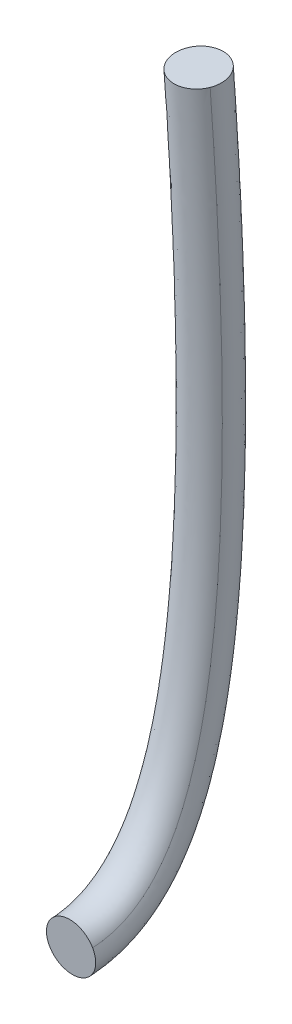
ISO-10303-21;
HEADER;
FILE_DESCRIPTION(('STEP AP214'),'2;1');
FILE_NAME('part.step','',(''),(''),'','','');
FILE_SCHEMA(('AUTOMOTIVE_DESIGN { 1 0 10303 214 1 1 1 1 }'));
ENDSEC;
DATA;
#1=APPLICATION_CONTEXT('core data for automotive mechanical design processes');
#2=APPLICATION_PROTOCOL_DEFINITION('international standard','automotive_design',2000,#1);
#3=PRODUCT_CONTEXT('',#1,'mechanical');
#4=PRODUCT('Part','Part','',(#3));
#5=PRODUCT_RELATED_PRODUCT_CATEGORY('part','',(#4));
#6=PRODUCT_DEFINITION_FORMATION('','',#4);
#7=PRODUCT_DEFINITION_CONTEXT('part definition',#1,'design');
#8=PRODUCT_DEFINITION('design','',#6,#7);
#9=PRODUCT_DEFINITION_SHAPE('','',#8);
#10=(LENGTH_UNIT() NAMED_UNIT(*) SI_UNIT(.MILLI.,.METRE.));
#11=(NAMED_UNIT(*) PLANE_ANGLE_UNIT() SI_UNIT($,.RADIAN.));
#12=(NAMED_UNIT(*) SI_UNIT($,.STERADIAN.) SOLID_ANGLE_UNIT());
#13=UNCERTAINTY_MEASURE_WITH_UNIT(LENGTH_MEASURE(1.E-05),#10,'distance_accuracy_value','');
#14=(GEOMETRIC_REPRESENTATION_CONTEXT(3) GLOBAL_UNCERTAINTY_ASSIGNED_CONTEXT((#13)) GLOBAL_UNIT_ASSIGNED_CONTEXT((#10,
#11,#12)) REPRESENTATION_CONTEXT('',''));
#15=CARTESIAN_POINT('',(0.,0.,0.));
#16=DIRECTION('',(0.,0.,1.));
#17=DIRECTION('',(1.,0.,0.));
#18=AXIS2_PLACEMENT_3D('',#15,#16,#17);
#19=CARTESIAN_POINT('',(-7.41712336251966,-7.28809487388892,11.1726740146158));
#20=CARTESIAN_POINT('',(-7.41712336251957,-7.28391219096522,11.0968550340527));
#21=CARTESIAN_POINT('',(-7.41712336251942,-7.25716208441642,10.9541599167949));
#22=CARTESIAN_POINT('',(-7.41712336251929,-7.13145043749268,10.6996011042162));
#23=CARTESIAN_POINT('',(-7.4171233625194,-6.82483017855781,10.4240618021488));
#24=CARTESIAN_POINT('',(-7.41712336251977,-6.16587858931999,10.1770965163929));
#25=CARTESIAN_POINT('',(-7.41712336252028,-5.06030301226849,10.0061301753601));
#26=CARTESIAN_POINT('',(-7.41712336252057,-3.38306327462149,9.96226459069808));
#27=CARTESIAN_POINT('',(-7.41712336252011,-1.84087282569988,10.0365899468089));
#28=CARTESIAN_POINT('',(-7.41712336251966,-1.00711974868314,10.0974834515681));
#29=CARTESIAN_POINT('',(-7.44624728504393,-7.22774584797431,11.1760032711987));
#30=CARTESIAN_POINT('',(-7.44624728504384,-7.22383978394823,11.1051985274795));
#31=CARTESIAN_POINT('',(-7.44624728504369,-7.19892670294291,10.9732426005261));
#32=CARTESIAN_POINT('',(-7.44624728504355,-7.08368946089006,10.7396358003898));
#33=CARTESIAN_POINT('',(-7.44624728504366,-6.79661128966213,10.479007592827));
#34=CARTESIAN_POINT('',(-7.44624728504404,-6.15268876220548,10.2363630655373));
#35=CARTESIAN_POINT('',(-7.44624728504454,-5.05655341289494,10.0666594916023));
#36=CARTESIAN_POINT('',(-7.44624728504483,-3.38436013673548,10.0227000403105));
#37=CARTESIAN_POINT('',(-7.44624728504437,-1.84433493411067,10.096938864866));
#38=CARTESIAN_POINT('',(-7.44624728504393,-1.01152234045852,10.1577636810294));
#39=CARTESIAN_POINT('',(-7.54798626965588,-7.14685085329117,11.1804659810684));
#40=CARTESIAN_POINT('',(-7.54798626965579,-7.14331557521144,11.1163824287406));
#41=CARTESIAN_POINT('',(-7.54798626965564,-7.12086506573495,10.9988217992572));
#42=CARTESIAN_POINT('',(-7.5479862696555,-7.01966804401707,10.793299696776));
#43=CARTESIAN_POINT('',(-7.54798626965561,-6.75878502921892,10.5526591708264));
#44=CARTESIAN_POINT('',(-7.54798626965598,-6.13500813711395,10.3158066226323));
#45=CARTESIAN_POINT('',(-7.54798626965649,-5.05152705179564,10.1477959163901));
#46=CARTESIAN_POINT('',(-7.54798626965678,-3.38609832030243,10.1037107525505));
#47=CARTESIAN_POINT('',(-7.54798626965632,-1.84897575446072,10.1778337128583));
#48=CARTESIAN_POINT('',(-7.54798626965588,-1.01742380502837,10.2385664573437));
#49=CARTESIAN_POINT('',(-7.72547161608299,-7.16764359030081,11.179318914392));
#50=CARTESIAN_POINT('',(-7.72547161608289,-7.16401268822835,11.1135019976718));
#51=CARTESIAN_POINT('',(-7.72547161608274,-7.14093395673362,10.9922384534935));
#52=CARTESIAN_POINT('',(-7.7254716160826,-7.03611984754312,10.779479727089));
#53=CARTESIAN_POINT('',(-7.72547161608271,-6.7685007427605,10.5337043102432));
#54=CARTESIAN_POINT('',(-7.72547161608309,-6.13954176046846,10.2953708448991));
#55=CARTESIAN_POINT('',(-7.72547161608359,-5.05281142108461,10.1269320940004));
#56=CARTESIAN_POINT('',(-7.72547161608388,-3.38564410214607,10.0828834176644));
#57=CARTESIAN_POINT('',(-7.72547161608343,-1.84778399374474,10.1570409342111));
#58=CARTESIAN_POINT('',(-7.72547161608298,-1.01590692995765,10.2177974235594));
#59=CARTESIAN_POINT('',(-7.82594457644654,-7.26777381200591,11.1737950605315));
#60=CARTESIAN_POINT('',(-7.82594457644644,-7.26368486066513,11.0996751408811));
#61=CARTESIAN_POINT('',(-7.82594457644629,-7.23754461764378,10.9606013980745));
#62=CARTESIAN_POINT('',(-7.82594457644615,-7.11537517687758,10.7131305648111));
#63=CARTESIAN_POINT('',(-7.82594457644626,-6.81534084691086,10.4426074044024));
#64=CARTESIAN_POINT('',(-7.82594457644664,-6.16145724500372,10.1970826708155));
#65=CARTESIAN_POINT('',(-7.82594457644714,-5.05905433994462,10.0265285319981));
#66=CARTESIAN_POINT('',(-7.82594457644744,-3.3835136394553,9.98262367084972));
#67=CARTESIAN_POINT('',(-7.82594457644698,-1.84203661074678,10.0569111181142));
#68=CARTESIAN_POINT('',(-7.82594457644653,-1.0086022140344,10.1177813479242));
#69=CARTESIAN_POINT('',(-7.84499999999932,-7.35208061372048,11.1691441325282));
#70=CARTESIAN_POINT('',(-7.84499999999923,-7.34760369485504,11.0879915731232));
#71=CARTESIAN_POINT('',(-7.84499999999908,-7.31891992392266,10.9339016888528));
#72=CARTESIAN_POINT('',(-7.84499999999894,-7.18207811949747,10.6570751476315));
#73=CARTESIAN_POINT('',(-7.84499999999905,-6.85472908612469,10.3657339472071));
#74=CARTESIAN_POINT('',(-7.84499999999943,-6.17983094897785,10.1142107097671));
#75=CARTESIAN_POINT('',(-7.84499999999993,-5.0642561029733,9.94192650096782));
#76=CARTESIAN_POINT('',(-7.84500000000023,-3.38166617764749,9.89817282182164));
#77=CARTESIAN_POINT('',(-7.84499999999977,-1.83720530777412,9.97260408602737));
#78=CARTESIAN_POINT('',(-7.84499999999932,-1.00245185077312,10.0335706539573));
#79=CARTESIAN_POINT('',(-7.845,-7.38568943191456,11.1672900449514));
#80=CARTESIAN_POINT('',(-7.84499999999991,-7.3810594674981,11.0833632476063));
#81=CARTESIAN_POINT('',(-7.84499999999976,-7.35133772082047,10.9233015622684));
#82=CARTESIAN_POINT('',(-7.84499999999962,-7.20868869492565,10.6348630581117));
#83=CARTESIAN_POINT('',(-7.84499999999973,-6.87046613629315,10.3352095257699));
#84=CARTESIAN_POINT('',(-7.84500000000011,-6.18721074057805,10.0812554270995));
#85=CARTESIAN_POINT('',(-7.84500000000061,-5.06636812071888,9.90824569486019));
#86=CARTESIAN_POINT('',(-7.84500000000091,-3.38096738006171,9.8645311512753));
#87=CARTESIAN_POINT('',(-7.84500000000045,-1.83527381521949,9.93899557759439));
#88=CARTESIAN_POINT('',(-7.845,-1.00000001490137,10.0000001490162));
#89=B_SPLINE_SURFACE_WITH_KNOTS('',3,3,((#19,#20,#21,#22,#23,#24,#25,#26,#27,#28),(#29,#30,#31,
#32,#33,#34,#35,#36,#37,#38),(#39,#40,#41,#42,#43,#44,#45,#46,#47,#48),(#49,#50,#51,#52,#53,#54,
#55,#56,#57,#58),(#59,#60,#61,#62,#63,#64,#65,#66,#67,#68),(#69,#70,#71,#72,#73,#74,#75,#76,#77,
#78),(#79,#80,#81,#82,#83,#84,#85,#86,#87,#88)),.UNSPECIFIED.,.F.,.F.,.F.,(4,1,1,1,4),(4,1,1,1,
1,1,1,4),(0.448798950512828,1.34639685153848,2.01959527730772,2.69279370307697,
3.14159265358979),(0.,0.0714285714285714,0.142857142857143,0.285714285714286,0.428571428571429,
0.571428571428571,0.785714285714286,1.),.UNSPECIFIED.);
#90=CARTESIAN_POINT('',(-7.845,-7.38568943191456,11.1672900449514));
#91=CARTESIAN_POINT('',(-7.84499999999991,-7.3810594674981,11.0833632476063));
#92=CARTESIAN_POINT('',(-7.84499999999976,-7.35133772082047,10.9233015622684));
#93=CARTESIAN_POINT('',(-7.84499999999962,-7.20868869492565,10.6348630581117));
#94=CARTESIAN_POINT('',(-7.84499999999973,-6.87046613629315,10.3352095257699));
#95=CARTESIAN_POINT('',(-7.84500000000011,-6.18721074057805,10.0812554270995));
#96=CARTESIAN_POINT('',(-7.84500000000061,-5.06636812071888,9.90824569486019));
#97=CARTESIAN_POINT('',(-7.84500000000091,-3.38096738006171,9.8645311512753));
#98=CARTESIAN_POINT('',(-7.84500000000045,-1.83527381521949,9.93899557759439));
#99=CARTESIAN_POINT('',(-7.845,-1.00000001490137,10.0000001490162));
#100=B_SPLINE_CURVE_WITH_KNOTS('',3,(#90,#91,#92,#93,#94,#95,#96,#97,#98,#99),.UNSPECIFIED.,.F.,
.F.,(4,1,1,1,1,1,1,4),(0.,0.0714285714285714,0.142857142857143,0.285714285714286,
0.428571428571429,0.571428571428571,0.785714285714286,1.),.UNSPECIFIED.);
#101=CARTESIAN_POINT('',(-7.845,-7.38568943191456,11.1672900449514));
#102=VERTEX_POINT('',#101);
#103=CARTESIAN_POINT('',(-7.845,-1.00000001490137,10.0000001490162));
#104=VERTEX_POINT('',#103);
#105=EDGE_CURVE('E11',#102,#104,#100,.T.);
#106=CARTESIAN_POINT('',(-7.845,-7.38568943191456,11.1672900449514));
#107=CARTESIAN_POINT('',(-7.84499099936549,-7.39838143308749,11.1665898691355));
#108=CARTESIAN_POINT('',(-7.84386907703709,-7.41108343198156,11.1658891417784));
#109=CARTESIAN_POINT('',(-7.83948816505506,-7.43612991695903,11.1645074098659));
#110=CARTESIAN_POINT('',(-7.83622488035257,-7.44847363234333,11.1638264478275));
#111=CARTESIAN_POINT('',(-7.82772050711996,-7.47243399401068,11.1625046337534));
#112=CARTESIAN_POINT('',(-7.82248342940231,-7.48405205939962,11.1618637034304));
#113=CARTESIAN_POINT('',(-7.81016527969655,-7.50626096383781,11.1606385114711));
#114=CARTESIAN_POINT('',(-7.80308527554079,-7.5168523928817,11.1600542172868));
#115=CARTESIAN_POINT('',(-7.7871070635714,-7.53685620668327,11.1589506729003));
#116=CARTESIAN_POINT('',(-7.77818157773625,-7.54624701604749,11.1584326129412));
#117=CARTESIAN_POINT('',(-7.75878124184229,-7.56326115701625,11.1574939989377));
#118=CARTESIAN_POINT('',(-7.74830726206972,-7.57088547528674,11.1570733904621));
#119=CARTESIAN_POINT('',(-7.7267837372992,-7.58382312050142,11.1563596632752));
#120=CARTESIAN_POINT('',(-7.71579491711388,-7.5892382212688,11.1560609300379));
#121=CARTESIAN_POINT('',(-7.69308980154159,-7.59827862400274,11.1555622008562));
#122=CARTESIAN_POINT('',(-7.68137262271154,-7.60190170274684,11.1553623275595));
#123=CARTESIAN_POINT('',(-7.65685068331824,-7.6074298452763,11.1550573581814));
#124=CARTESIAN_POINT('',(-7.64402167116172,-7.60922822727855,11.1549581473817));
#125=CARTESIAN_POINT('',(-7.6182544646805,-7.61065844937608,11.154879246749));
#126=CARTESIAN_POINT('',(-7.60531643307436,-7.61029308928923,11.1548994024591));
#127=CARTESIAN_POINT('',(-7.57974035588276,-7.60726997827412,11.1550661775163));
#128=CARTESIAN_POINT('',(-7.5671015798204,-7.604618567894,11.1552124470763));
#129=CARTESIAN_POINT('',(-7.54250553903045,-7.59709028288686,11.1556277577137));
#130=CARTESIAN_POINT('',(-7.53054866206545,-7.59221215595434,11.1558968678767));
#131=CARTESIAN_POINT('',(-7.50820785574523,-7.58083372805158,11.1565245781906));
#132=CARTESIAN_POINT('',(-7.49777489329327,-7.57442832629136,11.1568779430653));
#133=CARTESIAN_POINT('',(-7.47802544398121,-7.56007561287903,11.1576697348944));
#134=CARTESIAN_POINT('',(-7.46870960375714,-7.55212741509684,11.1581082107337));
#135=CARTESIAN_POINT('',(-7.4507805541399,-7.53421251006557,11.1590965169177));
#136=CARTESIAN_POINT('',(-7.44227377178441,-7.52413860526761,11.1596522609974));
#137=CARTESIAN_POINT('',(-7.42719182272323,-7.50266809659722,11.1608367180992));
#138=CARTESIAN_POINT('',(-7.42061371883068,-7.4912735412641,11.1614653181102));
#139=CARTESIAN_POINT('',(-7.4048702762178,-7.45682220075101,11.1633658848626));
#140=CARTESIAN_POINT('',(-7.39857690117864,-7.43237780088634,11.1647144017266));
#141=CARTESIAN_POINT('',(-7.39507383138844,-7.39527019971378,11.1667615056129));
#142=CARTESIAN_POINT('',(-7.39491073731864,-7.3827604992319,11.1674516245013));
#143=CARTESIAN_POINT('',(-7.39657661449667,-7.35785959497086,11.1688253252061));
#144=CARTESIAN_POINT('',(-7.39840449678146,-7.34546833015111,11.1695089103899));
#145=CARTESIAN_POINT('',(-7.40421280721926,-7.32053977730511,11.1708841363759));
#146=CARTESIAN_POINT('',(-7.40829611973981,-7.30802607025692,11.1715744762934));
#147=CARTESIAN_POINT('',(-7.41871945602452,-7.28397621510439,11.1729012274277));
#148=CARTESIAN_POINT('',(-7.42505811825102,-7.27243948239868,11.173537670895));
#149=CARTESIAN_POINT('',(-7.43915847468511,-7.2514747114763,11.1746942281144));
#150=CARTESIAN_POINT('',(-7.44678462257932,-7.24195461005501,11.1752194206896));
#151=CARTESIAN_POINT('',(-7.46344583726369,-7.22421623708068,11.1761979881826));
#152=CARTESIAN_POINT('',(-7.47248270377565,-7.21599965586832,11.1766512698499));
#153=CARTESIAN_POINT('',(-7.49229721208537,-7.20061785813574,11.1774998328645));
#154=CARTESIAN_POINT('',(-7.50314649049126,-7.1935444491704,11.177890049492));
#155=CARTESIAN_POINT('',(-7.52586266071935,-7.18130654153279,11.1785651744662));
#156=CARTESIAN_POINT('',(-7.53772814382776,-7.17613945135742,11.1788502257776));
#157=CARTESIAN_POINT('',(-7.56219688656159,-7.16798878795635,11.1792998709768));
#158=CARTESIAN_POINT('',(-7.57480019630874,-7.16500536325678,11.179464456671));
#159=CARTESIAN_POINT('',(-7.60034533783805,-7.16133291751397,11.179667053382));
#160=CARTESIAN_POINT('',(-7.61328748510116,-7.160646117329,11.1797049418814));
#161=CARTESIAN_POINT('',(-7.63846570021675,-7.16143824032908,11.1796612430698));
#162=CARTESIAN_POINT('',(-7.65070545112042,-7.16281329042796,11.1795853860941));
#163=CARTESIAN_POINT('',(-7.67480514677498,-7.16748669545434,11.179327569763));
#164=CARTESIAN_POINT('',(-7.68666533769147,-7.17078377603299,11.1791456807091));
#165=CARTESIAN_POINT('',(-7.71023771848537,-7.17948420372331,11.1786657068284));
#166=CARTESIAN_POINT('',(-7.7219157011262,-7.18498074477382,11.1783624807995));
#167=CARTESIAN_POINT('',(-7.74414223558698,-7.19791687566722,11.1776488371527));
#168=CARTESIAN_POINT('',(-7.7546901462053,-7.20535756046826,11.1772383591295));
#169=CARTESIAN_POINT('',(-7.77415159390446,-7.22169366812527,11.1763371499859));
#170=CARTESIAN_POINT('',(-7.78309826076089,-7.23054992289567,11.1758485796396));
#171=CARTESIAN_POINT('',(-7.79942138560578,-7.24960390927147,11.1747974340973));
#172=CARTESIAN_POINT('',(-7.80679829404541,-7.25980125468051,11.1742348802064));
#173=CARTESIAN_POINT('',(-7.81984452666176,-7.28152038250542,11.1730367076064));
#174=CARTESIAN_POINT('',(-7.82547590008455,-7.29306496053313,11.1723998313385));
#175=CARTESIAN_POINT('',(-7.83464844733389,-7.3169454559651,11.171082423221));
#176=CARTESIAN_POINT('',(-7.83819132119967,-7.3292807206556,11.1704019273795));
#177=CARTESIAN_POINT('',(-7.84210726412072,-7.34903662105252,11.1693120595573));
#178=CARTESIAN_POINT('',(-7.84318733611661,-7.35632581814247,11.1689099386112));
#179=CARTESIAN_POINT('',(-7.84463615326223,-7.37097205478329,11.1681019540743));
#180=CARTESIAN_POINT('',(-7.84500521966528,-7.37832906218494,11.1676960922571));
#181=CARTESIAN_POINT('',(-7.845,-7.38568943191456,11.1672900449514));
#182=B_SPLINE_CURVE_WITH_KNOTS('',3,(#106,#107,#108,#109,#110,#111,#112,#113,#114,#115,#116,
#117,#118,#119,#120,#121,#122,#123,#124,#125,#126,#127,#128,#129,#130,#131,#132,#133,#134,#135,
#136,#137,#138,#139,#140,#141,#142,#143,#144,#145,#146,#147,#148,#149,#150,#151,#152,#153,#154,
#155,#156,#157,#158,#159,#160,#161,#162,#163,#164,#165,#166,#167,#168,#169,#170,#171,#172,#173,
#174,#175,#176,#177,#178,#179,#180,#181),.UNSPECIFIED.,.T.,.F.,(4,2,2,2,2,2,2,2,2,2,2,2,2,2,2,2,
2,2,2,2,2,2,2,2,2,2,2,2,2,2,2,2,2,2,2,2,2,4),(0.,0.0381071198878031,0.076290907925305,
0.11439751996352,0.152482101147101,0.191176017541725,0.22984826923352,0.266452628884148,
0.303102287520451,0.341788974402301,0.380425612809799,0.418955432797512,0.45750694870695,
0.494101793894291,0.530717720458363,0.570102934209956,0.609427852860274,0.683596680807122,
0.72107760732468,0.758538043966807,0.797868208445443,0.837174669772215,0.873647223663283,
0.910166693444929,0.948861997200889,0.98750450193737,1.02614963477256,1.06483212703772,
1.10163020624672,1.1384039152176,1.17693638689319,1.21549060733687,1.25312019600418,
1.2907389720403,1.32912603371639,1.36748180501111,1.38959095117445,1.41169010542788),.UNSPECIFIED.);
#183=CARTESIAN_POINT('',(-7.41712336251966,-7.28809487388892,11.1726740146157));
#184=VERTEX_POINT('',#183);
#185=EDGE_CURVE('E44',#184,#102,#182,.T.);
#186=CARTESIAN_POINT('',(-7.41712336251966,-7.28809487388892,11.1726740146158));
#187=CARTESIAN_POINT('',(-7.41712336251957,-7.28391219096522,11.0968550340527));
#188=CARTESIAN_POINT('',(-7.41712336251942,-7.25716208441642,10.9541599167949));
#189=CARTESIAN_POINT('',(-7.41712336251929,-7.13145043749268,10.6996011042162));
#190=CARTESIAN_POINT('',(-7.4171233625194,-6.82483017855781,10.4240618021488));
#191=CARTESIAN_POINT('',(-7.41712336251977,-6.16587858931999,10.1770965163929));
#192=CARTESIAN_POINT('',(-7.41712336252028,-5.06030301226849,10.0061301753601));
#193=CARTESIAN_POINT('',(-7.41712336252057,-3.38306327462149,9.96226459069808));
#194=CARTESIAN_POINT('',(-7.41712336252011,-1.84087282569988,10.0365899468089));
#195=CARTESIAN_POINT('',(-7.41712336251966,-1.00711974868314,10.0974834515681));
#196=B_SPLINE_CURVE_WITH_KNOTS('',3,(#186,#187,#188,#189,#190,#191,#192,#193,#194,#195),
.UNSPECIFIED.,.F.,.F.,(4,1,1,1,1,1,1,4),(0.,0.0714285714285714,0.142857142857143,
0.285714285714286,0.428571428571429,0.571428571428571,0.785714285714286,1.),.UNSPECIFIED.);
#197=CARTESIAN_POINT('',(-7.41712336251966,-1.00711974868314,10.0974834515681));
#198=VERTEX_POINT('',#197);
#199=EDGE_CURVE('E28',#184,#198,#196,.T.);
#200=CARTESIAN_POINT('',(-7.845,-1.00000001490137,10.0000001490162));
#201=CARTESIAN_POINT('',(-7.84501317593806,-1.00091767228433,10.0125647019962));
#202=CARTESIAN_POINT('',(-7.84393574759237,-1.00183517933364,10.0251271966099));
#203=CARTESIAN_POINT('',(-7.83973365090151,-1.00364587141142,10.0499191690435));
#204=CARTESIAN_POINT('',(-7.83660681625396,-1.00453902966055,10.0621482802009));
#205=CARTESIAN_POINT('',(-7.82832211513364,-1.00627464341825,10.0859122812502));
#206=CARTESIAN_POINT('',(-7.82316358105131,-1.00711708215557,10.0974469415102));
#207=CARTESIAN_POINT('',(-7.81093575269779,-1.00872463946805,10.1194575953731));
#208=CARTESIAN_POINT('',(-7.80386645222267,-1.00948975779215,10.1299335855385));
#209=CARTESIAN_POINT('',(-7.7881808387846,-1.01091680662578,10.1494727196512));
#210=CARTESIAN_POINT('',(-7.77958178446605,-1.0115797483386,10.1585497089808));
#211=CARTESIAN_POINT('',(-7.76102444038905,-1.01279524851314,10.1751923215983));
#212=CARTESIAN_POINT('',(-7.75106662276773,-1.01334784515351,10.1827584676277));
#213=CARTESIAN_POINT('',(-7.72971656152982,-1.01433872591174,10.1963255941117));
#214=CARTESIAN_POINT('',(-7.71829113232454,-1.0147732367601,10.2022749110092));
#215=CARTESIAN_POINT('',(-7.69457290265436,-1.01549125157821,10.2121059605818));
#216=CARTESIAN_POINT('',(-7.6822795471806,-1.01577465791307,10.2159863564411));
#217=CARTESIAN_POINT('',(-7.65749382693607,-1.016183971958,10.2215906790329));
#218=CARTESIAN_POINT('',(-7.64501157621838,-1.01631316526939,10.2233595921759));
#219=CARTESIAN_POINT('',(-7.61992988023037,-1.01642111456128,10.2248376324795));
#220=CARTESIAN_POINT('',(-7.60733052426643,-1.01639997707101,10.224548218237));
#221=CARTESIAN_POINT('',(-7.58212614123041,-1.01619857032895,10.221790559738));
#222=CARTESIAN_POINT('',(-7.56952547347359,-1.01601531253878,10.2192813964527));
#223=CARTESIAN_POINT('',(-7.54497730519841,-1.01548792543046,10.2120604190088));
#224=CARTESIAN_POINT('',(-7.5330299361589,-1.01514376386195,10.2073481632785));
#225=CARTESIAN_POINT('',(-7.51058009652881,-1.01433323370056,10.196250394826));
#226=CARTESIAN_POINT('',(-7.50003792437721,-1.01387263624949,10.1899439005025));
#227=CARTESIAN_POINT('',(-7.48006162914825,-1.0128370085628,10.1757640996543));
#228=CARTESIAN_POINT('',(-7.47062835212084,-1.0122618918425,10.1678896089827));
#229=CARTESIAN_POINT('',(-7.45250157527695,-1.01096652328919,10.1501534395592));
#230=CARTESIAN_POINT('',(-7.44390612406106,-1.0102389287804,10.1401912249858));
#231=CARTESIAN_POINT('',(-7.4286137011592,-1.00868675931246,10.1189389407715));
#232=CARTESIAN_POINT('',(-7.42191381886624,-1.00786233581749,10.1076509449759));
#233=CARTESIAN_POINT('',(-7.40571252837889,-1.0053558117226,10.0733316495931));
#234=CARTESIAN_POINT('',(-7.39910115047677,-1.0035685372167,10.0488603102497));
#235=CARTESIAN_POINT('',(-7.39518661715354,-1.00085477060905,10.0117034530712));
#236=CARTESIAN_POINT('',(-7.39489032696615,-0.99994194857723,9.99920510565617));
#237=CARTESIAN_POINT('',(-7.39629288921267,-0.998123368471667,9.97430513044851));
#238=CARTESIAN_POINT('',(-7.39799075655713,-0.997217607132444,9.96190345794495));
#239=CARTESIAN_POINT('',(-7.40353873163258,-0.995394354859906,9.93693951148772));
#240=CARTESIAN_POINT('',(-7.40749083142287,-0.994478487619715,9.92439946911925));
#241=CARTESIAN_POINT('',(-7.41766639479969,-0.992716588496242,9.90027556918293));
#242=CARTESIAN_POINT('',(-7.42388823091448,-0.991870507105974,9.88869103376607));
#243=CARTESIAN_POINT('',(-7.43776747707168,-0.99033412180417,9.86765486614984));
#244=CARTESIAN_POINT('',(-7.445282345596,-0.989636895307396,9.85810845000322));
#245=CARTESIAN_POINT('',(-7.46172553467917,-0.988335926094833,9.84029559642617));
#246=CARTESIAN_POINT('',(-7.47065577757635,-0.987732312761388,9.8320309304971));
#247=CARTESIAN_POINT('',(-7.49026760777657,-0.986599206282035,9.81651645128502));
#248=CARTESIAN_POINT('',(-7.50102262529526,-0.986076442207981,9.8093587723665));
#249=CARTESIAN_POINT('',(-7.52356361106553,-0.985168522382637,9.79692754589911));
#250=CARTESIAN_POINT('',(-7.53534820771803,-0.984783186927519,9.79165153784778));
#251=CARTESIAN_POINT('',(-7.5597252025814,-0.984169226492469,9.78324519953794));
#252=CARTESIAN_POINT('',(-7.57232065893654,-0.983941237990559,9.78012358392825));
#253=CARTESIAN_POINT('',(-7.59787201531912,-0.98365516174762,9.77620663172221));
#254=CARTESIAN_POINT('',(-7.61082810233621,-0.983597163869312,9.77541252552508));
#255=CARTESIAN_POINT('',(-7.63594604438667,-0.983639713687139,9.77599511707882));
#256=CARTESIAN_POINT('',(-7.64811128899319,-0.983731460336026,9.777251311005));
#257=CARTESIAN_POINT('',(-7.67210276191912,-0.984051759997005,9.78163684980712));
#258=CARTESIAN_POINT('',(-7.68392882083022,-0.984280380166115,9.7847671141961));
#259=CARTESIAN_POINT('',(-7.70779022260617,-0.984891254956927,9.79313120390543));
#260=CARTESIAN_POINT('',(-7.71977799536472,-0.985283492831905,9.79850171980009));
#261=CARTESIAN_POINT('',(-7.74261084104115,-0.986214049124153,9.81124288447891));
#262=CARTESIAN_POINT('',(-7.75345728937329,-0.986752188849876,9.81861108662075));
#263=CARTESIAN_POINT('',(-7.78278287795125,-0.988518149737746,9.84279060018278));
#264=CARTESIAN_POINT('',(-7.79925675507728,-0.989928685834918,9.86210364212241));
#265=CARTESIAN_POINT('',(-7.82506945817773,-0.99305009840234,9.90484198249264));
#266=CARTESIAN_POINT('',(-7.83443174830102,-0.994759964074611,9.92825344109041));
#267=CARTESIAN_POINT('',(-7.84321018372584,-0.997670686675509,9.96810701717282));
#268=CARTESIAN_POINT('',(-7.84498327921999,-0.99883547184161,9.98405524055302));
#269=CARTESIAN_POINT('',(-7.845,-1.00000001490137,10.0000001490162));
#270=B_SPLINE_CURVE_WITH_KNOTS('',3,(#200,#201,#202,#203,#204,#205,#206,#207,#208,#209,#210,
#211,#212,#213,#214,#215,#216,#217,#218,#219,#220,#221,#222,#223,#224,#225,#226,#227,#228,#229,
#230,#231,#232,#233,#234,#235,#236,#237,#238,#239,#240,#241,#242,#243,#244,#245,#246,#247,#248,
#249,#250,#251,#252,#253,#254,#255,#256,#257,#258,#259,#260,#261,#262,#263,#264,#265,#266,#267,
#268,#269),.UNSPECIFIED.,.T.,.F.,(4,2,2,2,2,2,2,2,2,2,2,2,2,2,2,2,2,2,2,2,2,2,2,2,2,2,2,2,2,2,2,
2,2,2,4),(0.,0.0377492486610547,0.0755384642427688,0.113340107606875,0.151141873708153,
0.188541470911544,0.225928105603187,0.264397285071449,0.302891291040943,0.340549623316583,
0.378181272347947,0.416521425986163,0.454869267538888,0.491598549092436,0.528355674434292,
0.567686532370587,0.606956666705904,0.681504092331094,0.719000956041081,0.756479304546766,
0.795805585975363,0.83510372448074,0.871456565869648,0.907859211009024,0.94647297065383,
0.985036051596697,1.02375422242088,1.06249285727514,1.09903552900839,1.13559614512131,
1.17482150835163,1.21399904612316,1.28872782892458,1.36320896569524,1.41111423661185),.UNSPECIFIED.);
#271=EDGE_CURVE('E47',#104,#198,#270,.T.);
#272=ORIENTED_EDGE('',*,*,#105,.F.);
#273=ORIENTED_EDGE('',*,*,#185,.F.);
#274=ORIENTED_EDGE('',*,*,#199,.T.);
#275=ORIENTED_EDGE('',*,*,#271,.F.);
#276=EDGE_LOOP('',(#272,#273,#274,#275));
#277=FACE_BOUND('',#276,.T.);
#278=ADVANCED_FACE('F16',(#277),#89,.F.);
#279=CARTESIAN_POINT('',(-7.62,-1.00000001490116,10.0000001490116));
#280=DIRECTION('',(-5.32623886368089E-13,-0.997343536648528,-0.0728414024124084));
#281=DIRECTION('',(0.,0.0728414024124084,-0.997343536648528));
#282=AXIS2_PLACEMENT_3D('',#279,#280,#281);
#283=PLANE('',#282);
#284=ORIENTED_EDGE('',*,*,#271,.T.);
#285=EDGE_CURVE('E79',#198,#104,#270,.T.);
#286=ORIENTED_EDGE('',*,*,#285,.T.);
#287=EDGE_LOOP('',(#284,#286));
#288=FACE_BOUND('',#287,.T.);
#289=ADVANCED_FACE('F71',(#288),#283,.F.);
#290=CARTESIAN_POINT('',(-7.62,-7.38568943191911,11.1672900449514));
#291=DIRECTION('',(-1.11249196396045E-12,-0.0550829445172842,0.998481782118886));
#292=DIRECTION('',(0.,-0.998481782118886,-0.0550829445172842));
#293=AXIS2_PLACEMENT_3D('',#290,#291,#292);
#294=PLANE('',#293);
#295=EDGE_CURVE('E51',#102,#184,#182,.T.);
#296=ORIENTED_EDGE('',*,*,#295,.T.);
#297=ORIENTED_EDGE('',*,*,#185,.T.);
#298=EDGE_LOOP('',(#296,#297));
#299=FACE_BOUND('',#298,.T.);
#300=ADVANCED_FACE('F50',(#299),#294,.T.);
#301=CARTESIAN_POINT('',(-7.845,-7.38568943191456,11.1672900449514));
#302=CARTESIAN_POINT('',(-7.84499999999991,-7.3810594674981,11.0833632476063));
#303=CARTESIAN_POINT('',(-7.84499999999976,-7.35133772082047,10.9233015622684));
#304=CARTESIAN_POINT('',(-7.84499999999962,-7.20868869492565,10.6348630581117));
#305=CARTESIAN_POINT('',(-7.84499999999973,-6.87046613629315,10.3352095257699));
#306=CARTESIAN_POINT('',(-7.84500000000011,-6.18721074057805,10.0812554270995));
#307=CARTESIAN_POINT('',(-7.84500000000061,-5.06636812071888,9.90824569486019));
#308=CARTESIAN_POINT('',(-7.84500000000091,-3.38096738006171,9.8645311512753));
#309=CARTESIAN_POINT('',(-7.84500000000045,-1.83527381521949,9.93899557759439));
#310=CARTESIAN_POINT('',(-7.845,-1.00000001490137,10.0000001490162));
#311=CARTESIAN_POINT('',(-7.84500000000102,-7.43610265920569,11.1645089135862));
#312=CARTESIAN_POINT('',(-7.84500000000093,-7.43123996642441,11.0763634777044));
#313=CARTESIAN_POINT('',(-7.84500000000078,-7.40000815174358,10.9073160171067));
#314=CARTESIAN_POINT('',(-7.84500000000064,-7.24856642332976,10.6012824291832));
#315=CARTESIAN_POINT('',(-7.84500000000075,-6.89400338386197,10.2891862726741));
#316=CARTESIAN_POINT('',(-7.84500000000113,-6.19817270202607,10.0316631862401));
#317=CARTESIAN_POINT('',(-7.84500000000163,-5.0694612340294,9.85763518272215));
#318=CARTESIAN_POINT('',(-7.84500000000193,-3.37984553891513,9.81402063425969));
#319=CARTESIAN_POINT('',(-7.84500000000147,-1.8323873202791,9.8885820302603));
#320=CARTESIAN_POINT('',(-7.84500000000102,-0.996322261093758,9.94964439160444));
#321=CARTESIAN_POINT('',(-7.8213230241062,-7.50284933441553,11.1608267198065));
#322=CARTESIAN_POINT('',(-7.82132302410611,-7.49768322648806,11.0671813147682));
#323=CARTESIAN_POINT('',(-7.82132302410596,-7.46438212052614,10.8862786552973));
#324=CARTESIAN_POINT('',(-7.82132302410583,-7.30142109147906,10.557213644209));
#325=CARTESIAN_POINT('',(-7.82132302410594,-6.92526844906694,10.2286049543992));
#326=CARTESIAN_POINT('',(-7.82132302410632,-6.21284698493529,9.96624121141034));
#327=CARTESIAN_POINT('',(-7.82132302410682,-5.07366826959445,9.79076055574375));
#328=CARTESIAN_POINT('',(-7.82132302410711,-3.37847011854963,9.7472167872483));
#329=CARTESIAN_POINT('',(-7.82132302410666,-1.82854959475709,9.82183610216784));
#330=CARTESIAN_POINT('',(-7.82132302410621,-0.991452946985371,9.88297380601593));
#331=CARTESIAN_POINT('',(-7.72584022145776,-7.59922087533285,11.1555102199601));
#332=CARTESIAN_POINT('',(-7.72584022145766,-7.59361164415277,11.0538323740483));
#333=CARTESIAN_POINT('',(-7.72584022145752,-7.55739761006004,10.8557679232225));
#334=CARTESIAN_POINT('',(-7.72584022145738,-7.37767396793035,10.4931666791485));
#335=CARTESIAN_POINT('',(-7.7258402214575,-6.97030122882817,10.1407577962855));
#336=CARTESIAN_POINT('',(-7.72584022145788,-6.23386248441176,9.87152821745463));
#337=CARTESIAN_POINT('',(-7.72584022145838,-5.07962307116528,9.69406183551335));
#338=CARTESIAN_POINT('',(-7.72584022145867,-3.37636676847043,9.6506861219817));
#339=CARTESIAN_POINT('',(-7.72584022145821,-1.82302566831393,9.72546438840435));
#340=CARTESIAN_POINT('',(-7.72584022145776,-0.984422434943267,9.78671212636189));
#341=CARTESIAN_POINT('',(-7.56290282585875,-7.63627859669514,11.1534658677784));
#342=CARTESIAN_POINT('',(-7.56290282585866,-7.63050054429366,11.0487278202834));
#343=CARTESIAN_POINT('',(-7.56290282585851,-7.59314306154008,10.8440781237117));
#344=CARTESIAN_POINT('',(-7.56290282585838,-7.40701444564064,10.4686693685656));
#345=CARTESIAN_POINT('',(-7.5629028258585,-6.98765167944679,10.1070957261486));
#346=CARTESIAN_POINT('',(-7.56290282585887,-6.24199718663417,9.83518755304667));
#347=CARTESIAN_POINT('',(-7.56290282585938,-5.08195015573207,9.65692275251784));
#348=CARTESIAN_POINT('',(-7.56290282585967,-3.37559462287614,9.61359110906464));
#349=CARTESIAN_POINT('',(-7.56290282585922,-1.82089620691281,9.68840699113651));
#350=CARTESIAN_POINT('',(-7.56290282585877,-0.98171899413694,9.74969664992002));
#351=CARTESIAN_POINT('',(-7.38777687516913,-7.49738858096694,11.161127971552));
#352=CARTESIAN_POINT('',(-7.38777687516904,-7.4922465589224,11.06791916836));
#353=CARTESIAN_POINT('',(-7.38777687516889,-7.45912569211774,10.8879798681174));
#354=CARTESIAN_POINT('',(-7.38777687516876,-7.29708798693661,10.5607577906464));
#355=CARTESIAN_POINT('',(-7.38777687516887,-6.9226946111011,10.2335060807567));
#356=CARTESIAN_POINT('',(-7.38777687516925,-6.21162129621653,9.97155640735105));
#357=CARTESIAN_POINT('',(-7.38777687516975,-5.07330659645134,9.79621093676382));
#358=CARTESIAN_POINT('',(-7.38777687517004,-3.37856545955663,9.75267101376723));
#359=CARTESIAN_POINT('',(-7.38777687516958,-1.82886607833171,9.82729661137127));
#360=CARTESIAN_POINT('',(-7.38777687516913,-0.991851320743193,9.88842833433557));
#361=CARTESIAN_POINT('',(-7.3879994399954,-7.34844389980353,11.1693447580328));
#362=CARTESIAN_POINT('',(-7.38799943999531,-7.34398459798221,11.0885115406259));
#363=CARTESIAN_POINT('',(-7.38799943999516,-7.31539746588993,10.9350772330637));
#364=CARTESIAN_POINT('',(-7.38799943999502,-7.17921141409529,10.6595664080425));
#365=CARTESIAN_POINT('',(-7.38799943999513,-6.85304906745349,10.3691160114705));
#366=CARTESIAN_POINT('',(-7.38799943999551,-6.1790684164345,10.1178299672486));
#367=CARTESIAN_POINT('',(-7.38799943999601,-5.06405261164205,9.94560085911794));
#368=CARTESIAN_POINT('',(-7.3879994399963,-3.3817664125075,9.90182914108563));
#369=CARTESIAN_POINT('',(-7.38799943999584,-1.83741071728909,9.97624102875169));
#370=CARTESIAN_POINT('',(-7.3879994399954,-1.00271715690776,10.0372032221069));
#371=CARTESIAN_POINT('',(-7.41712336251966,-7.28809487388892,11.1726740146158));
#372=CARTESIAN_POINT('',(-7.41712336251957,-7.28391219096522,11.0968550340527));
#373=CARTESIAN_POINT('',(-7.41712336251942,-7.25716208441642,10.9541599167949));
#374=CARTESIAN_POINT('',(-7.41712336251929,-7.13145043749268,10.6996011042162));
#375=CARTESIAN_POINT('',(-7.4171233625194,-6.82483017855781,10.4240618021488));
#376=CARTESIAN_POINT('',(-7.41712336251977,-6.16587858931999,10.1770965163929));
#377=CARTESIAN_POINT('',(-7.41712336252028,-5.06030301226849,10.0061301753601));
#378=CARTESIAN_POINT('',(-7.41712336252057,-3.38306327462149,9.96226459069808));
#379=CARTESIAN_POINT('',(-7.41712336252011,-1.84087282569988,10.0365899468089));
#380=CARTESIAN_POINT('',(-7.41712336251966,-1.00711974868314,10.0974834515681));
#381=B_SPLINE_SURFACE_WITH_KNOTS('',3,3,((#301,#302,#303,#304,#305,#306,#307,#308,#309,#310),
(#311,#312,#313,#314,#315,#316,#317,#318,#319,#320),(#321,#322,#323,#324,#325,#326,#327,#328,
#329,#330),(#331,#332,#333,#334,#335,#336,#337,#338,#339,#340),(#341,#342,#343,#344,#345,#346,
#347,#348,#349,#350),(#351,#352,#353,#354,#355,#356,#357,#358,#359,#360),(#361,#362,#363,#364,
#365,#366,#367,#368,#369,#370),(#371,#372,#373,#374,#375,#376,#377,#378,#379,#380)),
.UNSPECIFIED.,.F.,.F.,.F.,(4,1,1,1,1,4),(4,1,1,1,1,1,1,4),(-3.14159265358979,-2.46839422782055,
-2.24399475256414,-1.34639685153848,-0.448798950512828,0.448798950512828),(0.,
0.0714285714285714,0.142857142857143,0.285714285714286,0.428571428571429,0.571428571428571,
0.785714285714286,1.),.UNSPECIFIED.);
#382=ORIENTED_EDGE('',*,*,#295,.F.);
#383=ORIENTED_EDGE('',*,*,#105,.T.);
#384=ORIENTED_EDGE('',*,*,#285,.F.);
#385=ORIENTED_EDGE('',*,*,#199,.F.);
#386=EDGE_LOOP('',(#382,#383,#384,#385));
#387=FACE_BOUND('',#386,.T.);
#388=ADVANCED_FACE('F53',(#387),#381,.F.);
#389=CLOSED_SHELL('',(#278,#289,#300,#388));
#390=MANIFOLD_SOLID_BREP('B1',#389);
#391=ADVANCED_BREP_SHAPE_REPRESENTATION('',(#18,#390),#14);
#392=SHAPE_DEFINITION_REPRESENTATION(#9,#391);
ENDSEC;
END-ISO-10303-21;
